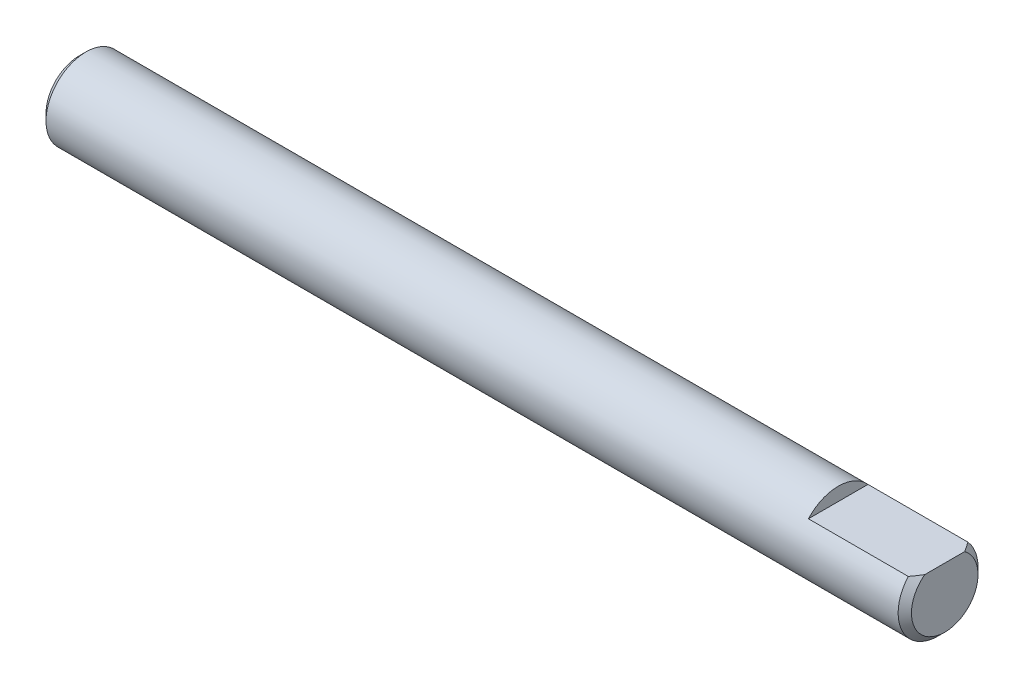
ISO-10303-21;
HEADER;
FILE_DESCRIPTION(('STEP AP214'),'2;1');
FILE_NAME('part.step','',(''),(''),'','','');
FILE_SCHEMA(('AUTOMOTIVE_DESIGN { 1 0 10303 214 1 1 1 1 }'));
ENDSEC;
DATA;
#1=APPLICATION_CONTEXT('core data for automotive mechanical design processes');
#2=APPLICATION_PROTOCOL_DEFINITION('international standard','automotive_design',2000,#1);
#3=PRODUCT_CONTEXT('',#1,'mechanical');
#4=PRODUCT('Part','Part','',(#3));
#5=PRODUCT_RELATED_PRODUCT_CATEGORY('part','',(#4));
#6=PRODUCT_DEFINITION_FORMATION('','',#4);
#7=PRODUCT_DEFINITION_CONTEXT('part definition',#1,'design');
#8=PRODUCT_DEFINITION('design','',#6,#7);
#9=PRODUCT_DEFINITION_SHAPE('','',#8);
#10=(LENGTH_UNIT() NAMED_UNIT(*) SI_UNIT(.MILLI.,.METRE.));
#11=(NAMED_UNIT(*) PLANE_ANGLE_UNIT() SI_UNIT($,.RADIAN.));
#12=(NAMED_UNIT(*) SI_UNIT($,.STERADIAN.) SOLID_ANGLE_UNIT());
#13=UNCERTAINTY_MEASURE_WITH_UNIT(LENGTH_MEASURE(1.E-05),#10,'distance_accuracy_value','');
#14=(GEOMETRIC_REPRESENTATION_CONTEXT(3) GLOBAL_UNCERTAINTY_ASSIGNED_CONTEXT((#13)) GLOBAL_UNIT_ASSIGNED_CONTEXT((#10,
#11,#12)) REPRESENTATION_CONTEXT('',''));
#15=CARTESIAN_POINT('',(0.,0.,0.));
#16=DIRECTION('',(0.,0.,1.));
#17=DIRECTION('',(1.,0.,0.));
#18=AXIS2_PLACEMENT_3D('',#15,#16,#17);
#19=CARTESIAN_POINT('',(32.5,0.,0.));
#20=DIRECTION('',(-1.,0.,0.));
#21=DIRECTION('',(0.,0.,1.));
#22=AXIS2_PLACEMENT_3D('',#19,#20,#21);
#23=CYLINDRICAL_SURFACE('',#22,3.);
#24=CARTESIAN_POINT('',(-32.,0.,0.));
#25=DIRECTION('',(1.,0.,0.));
#26=DIRECTION('',(0.,0.,-1.));
#27=AXIS2_PLACEMENT_3D('',#24,#25,#26);
#28=CIRCLE('',#27,3.);
#29=CARTESIAN_POINT('',(-32.,0.,-3.));
#30=VERTEX_POINT('',#29);
#31=EDGE_CURVE('E92',#30,#30,#28,.T.);
#32=ORIENTED_EDGE('',*,*,#31,.T.);
#33=EDGE_LOOP('',(#32));
#34=FACE_BOUND('',#33,.T.);
#35=DIRECTION('',(1.,0.,0.));
#36=VECTOR('',#35,1.);
#37=CARTESIAN_POINT('',(24.5,2.,-2.23606797749979));
#38=LINE('',#37,#36);
#39=CARTESIAN_POINT('',(24.5,2.,-2.23606797749979));
#40=VERTEX_POINT('',#39);
#41=CARTESIAN_POINT('',(32.,2.,-2.23606797749979));
#42=VERTEX_POINT('',#41);
#43=EDGE_CURVE('E84',#40,#42,#38,.T.);
#44=ORIENTED_EDGE('',*,*,#43,.T.);
#45=CARTESIAN_POINT('',(32.,0.,0.));
#46=DIRECTION('',(1.,0.,0.));
#47=DIRECTION('',(0.,0.,-1.));
#48=AXIS2_PLACEMENT_3D('',#45,#46,#47);
#49=CIRCLE('',#48,3.);
#50=CARTESIAN_POINT('',(32.,2.,2.23606797749979));
#51=VERTEX_POINT('',#50);
#52=EDGE_CURVE('E86',#42,#51,#49,.F.);
#53=ORIENTED_EDGE('',*,*,#52,.T.);
#54=DIRECTION('',(1.,0.,0.));
#55=VECTOR('',#54,1.);
#56=CARTESIAN_POINT('',(24.5,2.,2.23606797749979));
#57=LINE('',#56,#55);
#58=CARTESIAN_POINT('',(24.5,2.,2.23606797749979));
#59=VERTEX_POINT('',#58);
#60=EDGE_CURVE('E83',#59,#51,#57,.T.);
#61=ORIENTED_EDGE('',*,*,#60,.F.);
#62=CARTESIAN_POINT('',(24.5,0.,0.));
#63=DIRECTION('',(1.,0.,0.));
#64=DIRECTION('',(0.,0.,-1.));
#65=AXIS2_PLACEMENT_3D('',#62,#63,#64);
#66=CIRCLE('',#65,3.);
#67=EDGE_CURVE('E73',#40,#59,#66,.T.);
#68=ORIENTED_EDGE('',*,*,#67,.F.);
#69=EDGE_LOOP('',(#44,#53,#61,#68));
#70=FACE_BOUND('',#69,.T.);
#71=ADVANCED_FACE('F32',(#34,#70),#23,.T.);
#72=CARTESIAN_POINT('',(32.5,0.,0.));
#73=DIRECTION('',(1.,0.,0.));
#74=DIRECTION('',(0.,0.,-1.));
#75=AXIS2_PLACEMENT_3D('',#72,#73,#74);
#76=PLANE('',#75);
#77=DIRECTION('',(0.,0.,-1.));
#78=VECTOR('',#77,1.);
#79=CARTESIAN_POINT('',(32.5,2.,2.23606797749979));
#80=LINE('',#79,#78);
#81=CARTESIAN_POINT('',(32.5,2.,1.49999999999997));
#82=VERTEX_POINT('',#81);
#83=CARTESIAN_POINT('',(32.5,2.,-1.49999999999997));
#84=VERTEX_POINT('',#83);
#85=EDGE_CURVE('E80',#82,#84,#80,.T.);
#86=ORIENTED_EDGE('',*,*,#85,.F.);
#87=CARTESIAN_POINT('',(32.5,0.,0.));
#88=DIRECTION('',(1.,0.,0.));
#89=DIRECTION('',(0.,0.,-1.));
#90=AXIS2_PLACEMENT_3D('',#87,#88,#89);
#91=CIRCLE('',#90,2.49999999999998);
#92=EDGE_CURVE('E98',#82,#84,#91,.T.);
#93=ORIENTED_EDGE('',*,*,#92,.T.);
#94=EDGE_LOOP('',(#86,#93));
#95=FACE_BOUND('',#94,.T.);
#96=ADVANCED_FACE('F108',(#95),#76,.T.);
#97=CARTESIAN_POINT('',(-32.5,0.,0.));
#98=DIRECTION('',(1.,0.,0.));
#99=DIRECTION('',(0.,0.,-1.));
#100=AXIS2_PLACEMENT_3D('',#97,#98,#99);
#101=PLANE('',#100);
#102=CARTESIAN_POINT('',(-32.5,0.,0.));
#103=DIRECTION('',(1.,0.,0.));
#104=DIRECTION('',(0.,0.,-1.));
#105=AXIS2_PLACEMENT_3D('',#102,#103,#104);
#106=CIRCLE('',#105,2.50000000000002);
#107=CARTESIAN_POINT('',(-32.5,0.,-2.50000000000002));
#108=VERTEX_POINT('',#107);
#109=EDGE_CURVE('E95',#108,#108,#106,.F.);
#110=ORIENTED_EDGE('',*,*,#109,.T.);
#111=EDGE_LOOP('',(#110));
#112=FACE_BOUND('',#111,.T.);
#113=ADVANCED_FACE('F107',(#112),#101,.F.);
#114=CARTESIAN_POINT('',(24.5,2.,2.23606797749979));
#115=DIRECTION('',(0.,-1.,0.));
#116=DIRECTION('',(0.,0.,-1.));
#117=AXIS2_PLACEMENT_3D('',#114,#115,#116);
#118=PLANE('',#117);
#119=ORIENTED_EDGE('',*,*,#85,.T.);
#120=CARTESIAN_POINT('',(32.5,2.,-1.49999999999997));
#121=CARTESIAN_POINT('',(32.4617993221427,2.,-1.56363441041132));
#122=CARTESIAN_POINT('',(32.4224920359348,2.,-1.62658889898812));
#123=CARTESIAN_POINT('',(32.3420572974233,2.,-1.75127191097623));
#124=CARTESIAN_POINT('',(32.300930975112,2.,-1.81300116191586));
#125=CARTESIAN_POINT('',(32.2172105304513,2.,-1.93543485253752));
#126=CARTESIAN_POINT('',(32.1746166557635,2.,-1.99613946258491));
#127=CARTESIAN_POINT('',(32.0881782263033,2.,-2.11670900846293));
#128=CARTESIAN_POINT('',(32.0443329228987,2.,-2.17657340830976));
#129=CARTESIAN_POINT('',(32.,2.,-2.23606797749979));
#130=B_SPLINE_CURVE_WITH_KNOTS('',3,(#120,#121,#122,#123,#124,#125,#126,#127,#128,#129),
.UNSPECIFIED.,.F.,.F.,(4,2,2,2,4),(0.,0.222629901922151,0.445123396049353,0.667579524717594,
0.890171642368406),.UNSPECIFIED.);
#131=EDGE_CURVE('E11',#84,#42,#130,.T.);
#132=ORIENTED_EDGE('',*,*,#131,.T.);
#133=ORIENTED_EDGE('',*,*,#43,.F.);
#134=DIRECTION('',(0.,0.,-1.));
#135=VECTOR('',#134,1.);
#136=CARTESIAN_POINT('',(24.5,2.,2.23606797749979));
#137=LINE('',#136,#135);
#138=EDGE_CURVE('E76',#59,#40,#137,.T.);
#139=ORIENTED_EDGE('',*,*,#138,.F.);
#140=ORIENTED_EDGE('',*,*,#60,.T.);
#141=CARTESIAN_POINT('',(32.,2.,2.23606797749979));
#142=CARTESIAN_POINT('',(32.0443329228987,2.,2.17657340830977));
#143=CARTESIAN_POINT('',(32.0881782263033,2.,2.11670900846293));
#144=CARTESIAN_POINT('',(32.1746166557635,2.,1.99613946258491));
#145=CARTESIAN_POINT('',(32.2172105304513,2.,1.93543485253752));
#146=CARTESIAN_POINT('',(32.300930975112,2.,1.81300116191586));
#147=CARTESIAN_POINT('',(32.3420572974233,2.,1.75127191097623));
#148=CARTESIAN_POINT('',(32.4224920359348,2.,1.62658889898812));
#149=CARTESIAN_POINT('',(32.4617993221427,2.,1.56363441041132));
#150=CARTESIAN_POINT('',(32.5,2.,1.49999999999997));
#151=B_SPLINE_CURVE_WITH_KNOTS('',3,(#141,#142,#143,#144,#145,#146,#147,#148,#149,#150),
.UNSPECIFIED.,.F.,.F.,(4,2,2,2,4),(0.,0.222592117650813,0.445048246319054,0.667541740446256,
0.890171642368407),.UNSPECIFIED.);
#152=EDGE_CURVE('E46',#51,#82,#151,.T.);
#153=ORIENTED_EDGE('',*,*,#152,.T.);
#154=EDGE_LOOP('',(#119,#132,#133,#139,#140,#153));
#155=FACE_BOUND('',#154,.T.);
#156=ADVANCED_FACE('F82',(#155),#118,.F.);
#157=CARTESIAN_POINT('',(24.5,0.,0.));
#158=DIRECTION('',(1.,0.,0.));
#159=DIRECTION('',(0.,0.,-1.));
#160=AXIS2_PLACEMENT_3D('',#157,#158,#159);
#161=PLANE('',#160);
#162=ORIENTED_EDGE('',*,*,#67,.T.);
#163=ORIENTED_EDGE('',*,*,#138,.T.);
#164=EDGE_LOOP('',(#162,#163));
#165=FACE_BOUND('',#164,.T.);
#166=ADVANCED_FACE('F75',(#165),#161,.T.);
#167=CARTESIAN_POINT('',(-32.,0.,0.));
#168=DIRECTION('',(1.,0.,0.));
#169=DIRECTION('',(0.,0.,-1.));
#170=AXIS2_PLACEMENT_3D('',#167,#168,#169);
#171=CONICAL_SURFACE('',#170,3.,0.785398163397446);
#172=ORIENTED_EDGE('',*,*,#109,.F.);
#173=EDGE_LOOP('',(#172));
#174=FACE_BOUND('',#173,.T.);
#175=ORIENTED_EDGE('',*,*,#31,.F.);
#176=EDGE_LOOP('',(#175));
#177=FACE_BOUND('',#176,.T.);
#178=ADVANCED_FACE('F118',(#174,#177),#171,.T.);
#179=CARTESIAN_POINT('',(32.5,0.,0.));
#180=DIRECTION('',(-1.,0.,0.));
#181=DIRECTION('',(0.,0.,1.));
#182=AXIS2_PLACEMENT_3D('',#179,#180,#181);
#183=CONICAL_SURFACE('',#182,2.49999999999998,0.785398163397453);
#184=ORIENTED_EDGE('',*,*,#152,.F.);
#185=ORIENTED_EDGE('',*,*,#52,.F.);
#186=ORIENTED_EDGE('',*,*,#131,.F.);
#187=ORIENTED_EDGE('',*,*,#92,.F.);
#188=EDGE_LOOP('',(#184,#185,#186,#187));
#189=FACE_BOUND('',#188,.T.);
#190=ADVANCED_FACE('F34',(#189),#183,.T.);
#191=CLOSED_SHELL('',(#71,#96,#113,#156,#166,#178,#190));
#192=MANIFOLD_SOLID_BREP('B2',#191);
#193=ADVANCED_BREP_SHAPE_REPRESENTATION('',(#18,#192),#14);
#194=SHAPE_DEFINITION_REPRESENTATION(#9,#193);
ENDSEC;
END-ISO-10303-21;
